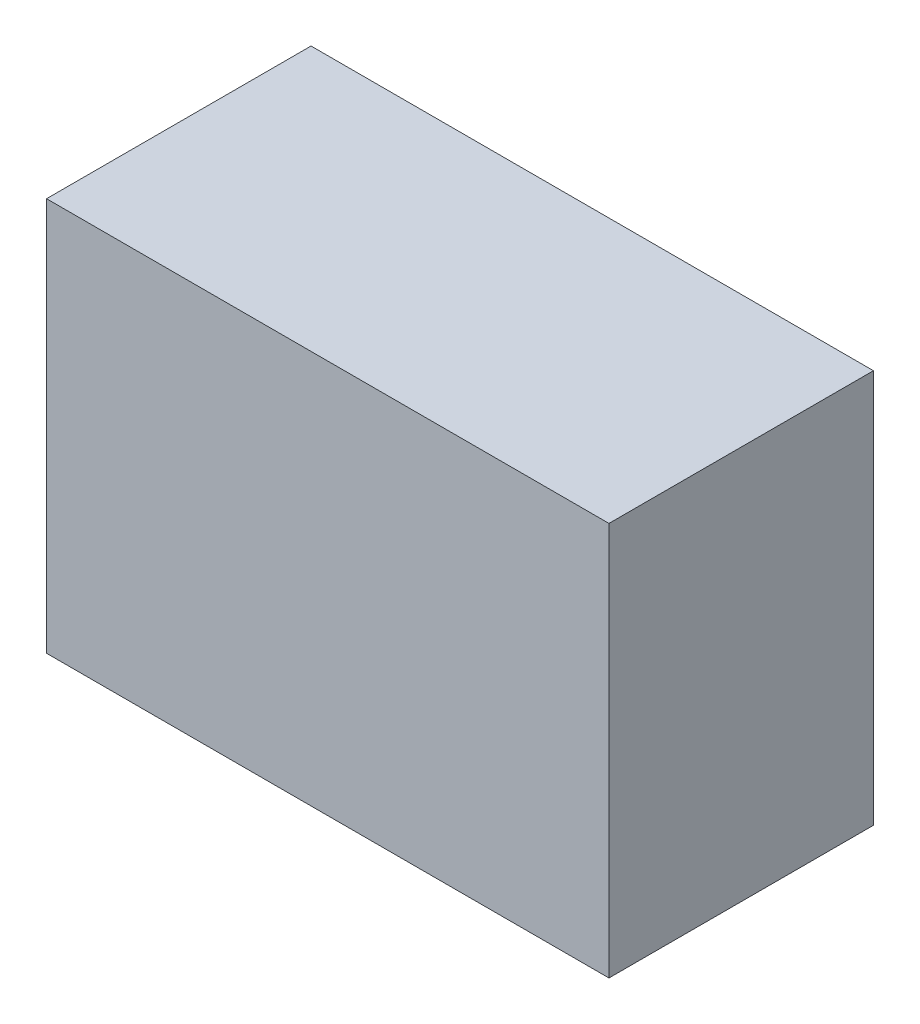
ISO-10303-21;
HEADER;
FILE_DESCRIPTION(('STEP AP214'),'2;1');
FILE_NAME('part.step','',(''),(''),'','','');
FILE_SCHEMA(('AUTOMOTIVE_DESIGN { 1 0 10303 214 1 1 1 1 }'));
ENDSEC;
DATA;
#1=APPLICATION_CONTEXT('core data for automotive mechanical design processes');
#2=APPLICATION_PROTOCOL_DEFINITION('international standard','automotive_design',2000,#1);
#3=PRODUCT_CONTEXT('',#1,'mechanical');
#4=PRODUCT('Part','Part','',(#3));
#5=PRODUCT_RELATED_PRODUCT_CATEGORY('part','',(#4));
#6=PRODUCT_DEFINITION_FORMATION('','',#4);
#7=PRODUCT_DEFINITION_CONTEXT('part definition',#1,'design');
#8=PRODUCT_DEFINITION('design','',#6,#7);
#9=PRODUCT_DEFINITION_SHAPE('','',#8);
#10=(LENGTH_UNIT() NAMED_UNIT(*) SI_UNIT(.MILLI.,.METRE.));
#11=(NAMED_UNIT(*) PLANE_ANGLE_UNIT() SI_UNIT($,.RADIAN.));
#12=(NAMED_UNIT(*) SI_UNIT($,.STERADIAN.) SOLID_ANGLE_UNIT());
#13=UNCERTAINTY_MEASURE_WITH_UNIT(LENGTH_MEASURE(1.E-05),#10,'distance_accuracy_value','');
#14=(GEOMETRIC_REPRESENTATION_CONTEXT(3) GLOBAL_UNCERTAINTY_ASSIGNED_CONTEXT((#13)) GLOBAL_UNIT_ASSIGNED_CONTEXT((#10,
#11,#12)) REPRESENTATION_CONTEXT('',''));
#15=CARTESIAN_POINT('',(0.,0.,0.));
#16=DIRECTION('',(0.,0.,1.));
#17=DIRECTION('',(1.,0.,0.));
#18=AXIS2_PLACEMENT_3D('',#15,#16,#17);
#19=CARTESIAN_POINT('',(0.,0.,47.0258));
#20=DIRECTION('',(-1.,0.,0.));
#21=DIRECTION('',(0.,0.,1.));
#22=AXIS2_PLACEMENT_3D('',#19,#20,#21);
#23=PLANE('',#22);
#24=DIRECTION('',(0.,1.,0.));
#25=VECTOR('',#24,1.);
#26=CARTESIAN_POINT('',(0.,0.,0.));
#27=LINE('',#26,#25);
#28=CARTESIAN_POINT('',(0.,0.,0.));
#29=VERTEX_POINT('',#28);
#30=CARTESIAN_POINT('',(0.,70.,0.));
#31=VERTEX_POINT('',#30);
#32=EDGE_CURVE('E98',#29,#31,#27,.T.);
#33=ORIENTED_EDGE('',*,*,#32,.T.);
#34=DIRECTION('',(0.,0.,-1.));
#35=VECTOR('',#34,1.);
#36=CARTESIAN_POINT('',(0.,70.,47.0258));
#37=LINE('',#36,#35);
#38=CARTESIAN_POINT('',(0.,70.,47.0258));
#39=VERTEX_POINT('',#38);
#40=EDGE_CURVE('E11',#39,#31,#37,.T.);
#41=ORIENTED_EDGE('',*,*,#40,.F.);
#42=DIRECTION('',(0.,1.,0.));
#43=VECTOR('',#42,1.);
#44=CARTESIAN_POINT('',(0.,0.,47.0258));
#45=LINE('',#44,#43);
#46=CARTESIAN_POINT('',(0.,0.,47.0258));
#47=VERTEX_POINT('',#46);
#48=EDGE_CURVE('E86',#47,#39,#45,.T.);
#49=ORIENTED_EDGE('',*,*,#48,.F.);
#50=DIRECTION('',(0.,0.,-1.));
#51=VECTOR('',#50,1.);
#52=CARTESIAN_POINT('',(0.,0.,47.0258));
#53=LINE('',#52,#51);
#54=EDGE_CURVE('E94',#47,#29,#53,.T.);
#55=ORIENTED_EDGE('',*,*,#54,.T.);
#56=EDGE_LOOP('',(#33,#41,#49,#55));
#57=FACE_BOUND('',#56,.T.);
#58=ADVANCED_FACE('F35',(#57),#23,.F.);
#59=CARTESIAN_POINT('',(0.,70.,47.0258));
#60=DIRECTION('',(0.,-1.,0.));
#61=DIRECTION('',(1.,0.,0.));
#62=AXIS2_PLACEMENT_3D('',#59,#60,#61);
#63=PLANE('',#62);
#64=DIRECTION('',(-1.,0.,0.));
#65=VECTOR('',#64,1.);
#66=CARTESIAN_POINT('',(0.,70.,0.));
#67=LINE('',#66,#65);
#68=CARTESIAN_POINT('',(-100.,70.,0.));
#69=VERTEX_POINT('',#68);
#70=EDGE_CURVE('E90',#31,#69,#67,.T.);
#71=ORIENTED_EDGE('',*,*,#70,.T.);
#72=DIRECTION('',(0.,0.,-1.));
#73=VECTOR('',#72,1.);
#74=CARTESIAN_POINT('',(-100.,70.,47.0258));
#75=LINE('',#74,#73);
#76=CARTESIAN_POINT('',(-100.,70.,47.0258));
#77=VERTEX_POINT('',#76);
#78=EDGE_CURVE('E43',#77,#69,#75,.T.);
#79=ORIENTED_EDGE('',*,*,#78,.F.);
#80=DIRECTION('',(-1.,0.,0.));
#81=VECTOR('',#80,1.);
#82=CARTESIAN_POINT('',(0.,70.,47.0258));
#83=LINE('',#82,#81);
#84=EDGE_CURVE('E81',#39,#77,#83,.T.);
#85=ORIENTED_EDGE('',*,*,#84,.F.);
#86=ORIENTED_EDGE('',*,*,#40,.T.);
#87=EDGE_LOOP('',(#71,#79,#85,#86));
#88=FACE_BOUND('',#87,.T.);
#89=ADVANCED_FACE('F89',(#88),#63,.F.);
#90=CARTESIAN_POINT('',(-100.,0.,47.0258));
#91=DIRECTION('',(1.,0.,0.));
#92=DIRECTION('',(0.,0.,-1.));
#93=AXIS2_PLACEMENT_3D('',#90,#91,#92);
#94=PLANE('',#93);
#95=DIRECTION('',(0.,-1.,0.));
#96=VECTOR('',#95,1.);
#97=CARTESIAN_POINT('',(-100.,0.,0.));
#98=LINE('',#97,#96);
#99=CARTESIAN_POINT('',(-100.,0.,0.));
#100=VERTEX_POINT('',#99);
#101=EDGE_CURVE('E68',#69,#100,#98,.T.);
#102=ORIENTED_EDGE('',*,*,#101,.T.);
#103=DIRECTION('',(0.,0.,-1.));
#104=VECTOR('',#103,1.);
#105=CARTESIAN_POINT('',(-100.,0.,47.0258));
#106=LINE('',#105,#104);
#107=CARTESIAN_POINT('',(-100.,0.,47.0258));
#108=VERTEX_POINT('',#107);
#109=EDGE_CURVE('E91',#108,#100,#106,.T.);
#110=ORIENTED_EDGE('',*,*,#109,.F.);
#111=DIRECTION('',(0.,-1.,0.));
#112=VECTOR('',#111,1.);
#113=CARTESIAN_POINT('',(-100.,0.,47.0258));
#114=LINE('',#113,#112);
#115=EDGE_CURVE('E84',#77,#108,#114,.T.);
#116=ORIENTED_EDGE('',*,*,#115,.F.);
#117=ORIENTED_EDGE('',*,*,#78,.T.);
#118=EDGE_LOOP('',(#102,#110,#116,#117));
#119=FACE_BOUND('',#118,.T.);
#120=ADVANCED_FACE('F92',(#119),#94,.F.);
#121=CARTESIAN_POINT('',(0.,0.,47.0258));
#122=DIRECTION('',(0.,1.,0.));
#123=DIRECTION('',(-1.,0.,0.));
#124=AXIS2_PLACEMENT_3D('',#121,#122,#123);
#125=PLANE('',#124);
#126=DIRECTION('',(1.,0.,0.));
#127=VECTOR('',#126,1.);
#128=CARTESIAN_POINT('',(0.,0.,0.));
#129=LINE('',#128,#127);
#130=EDGE_CURVE('E74',#100,#29,#129,.T.);
#131=ORIENTED_EDGE('',*,*,#130,.T.);
#132=ORIENTED_EDGE('',*,*,#54,.F.);
#133=DIRECTION('',(1.,0.,0.));
#134=VECTOR('',#133,1.);
#135=CARTESIAN_POINT('',(0.,0.,47.0258));
#136=LINE('',#135,#134);
#137=EDGE_CURVE('E51',#108,#47,#136,.T.);
#138=ORIENTED_EDGE('',*,*,#137,.F.);
#139=ORIENTED_EDGE('',*,*,#109,.T.);
#140=EDGE_LOOP('',(#131,#132,#138,#139));
#141=FACE_BOUND('',#140,.T.);
#142=ADVANCED_FACE('F105',(#141),#125,.F.);
#143=CARTESIAN_POINT('',(0.,0.,47.0258));
#144=DIRECTION('',(0.,0.,1.));
#145=DIRECTION('',(1.,0.,0.));
#146=AXIS2_PLACEMENT_3D('',#143,#144,#145);
#147=PLANE('',#146);
#148=ORIENTED_EDGE('',*,*,#48,.T.);
#149=ORIENTED_EDGE('',*,*,#84,.T.);
#150=ORIENTED_EDGE('',*,*,#115,.T.);
#151=ORIENTED_EDGE('',*,*,#137,.T.);
#152=EDGE_LOOP('',(#148,#149,#150,#151));
#153=FACE_BOUND('',#152,.T.);
#154=ADVANCED_FACE('F82',(#153),#147,.T.);
#155=CARTESIAN_POINT('',(0.,0.,0.));
#156=DIRECTION('',(0.,0.,1.));
#157=DIRECTION('',(1.,0.,0.));
#158=AXIS2_PLACEMENT_3D('',#155,#156,#157);
#159=PLANE('',#158);
#160=ORIENTED_EDGE('',*,*,#32,.F.);
#161=ORIENTED_EDGE('',*,*,#130,.F.);
#162=ORIENTED_EDGE('',*,*,#101,.F.);
#163=ORIENTED_EDGE('',*,*,#70,.F.);
#164=EDGE_LOOP('',(#160,#161,#162,#163));
#165=FACE_BOUND('',#164,.T.);
#166=ADVANCED_FACE('F108',(#165),#159,.F.);
#167=CLOSED_SHELL('',(#58,#89,#120,#142,#154,#166));
#168=MANIFOLD_SOLID_BREP('B2',#167);
#169=ADVANCED_BREP_SHAPE_REPRESENTATION('',(#18,#168),#14);
#170=SHAPE_DEFINITION_REPRESENTATION(#9,#169);
ENDSEC;
END-ISO-10303-21;
